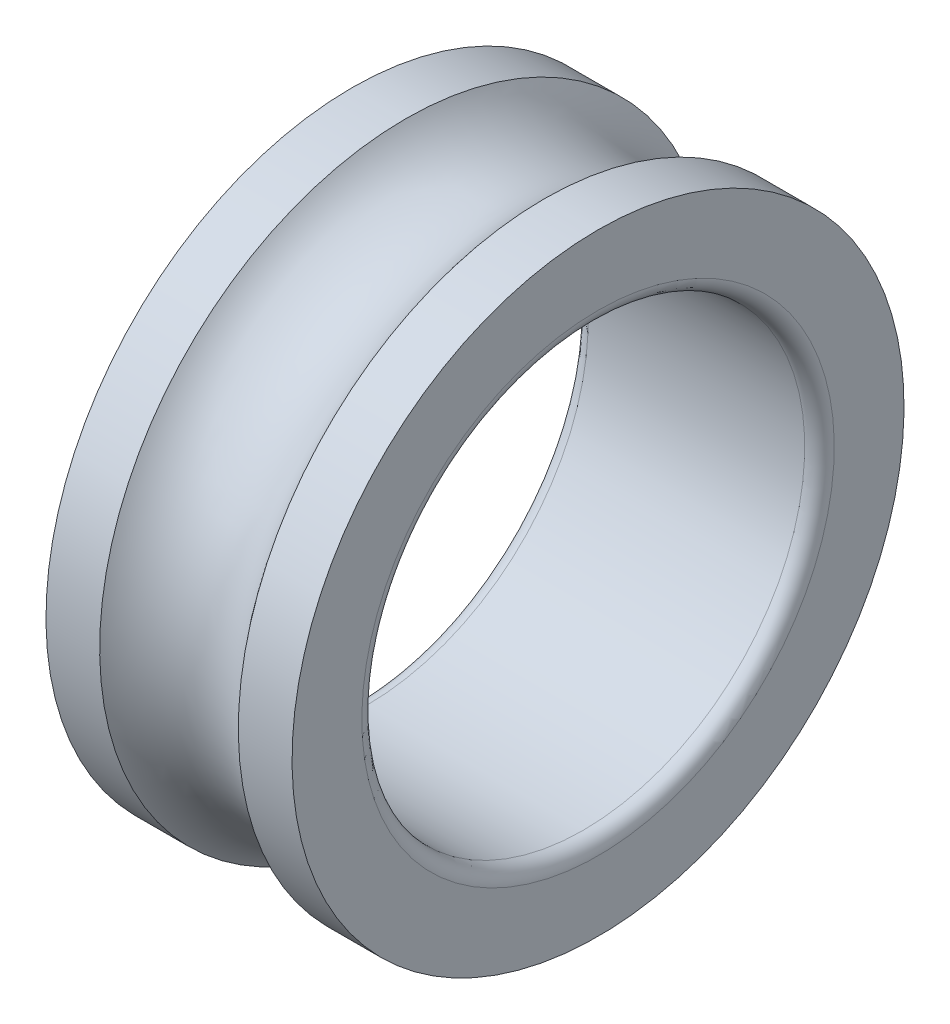
ISO-10303-21;
HEADER;
FILE_DESCRIPTION(('STEP AP214'),'2;1');
FILE_NAME('part.step','',(''),(''),'','','');
FILE_SCHEMA(('AUTOMOTIVE_DESIGN { 1 0 10303 214 1 1 1 1 }'));
ENDSEC;
DATA;
#1=APPLICATION_CONTEXT('core data for automotive mechanical design processes');
#2=APPLICATION_PROTOCOL_DEFINITION('international standard','automotive_design',2000,#1);
#3=PRODUCT_CONTEXT('',#1,'mechanical');
#4=PRODUCT('Part','Part','',(#3));
#5=PRODUCT_RELATED_PRODUCT_CATEGORY('part','',(#4));
#6=PRODUCT_DEFINITION_FORMATION('','',#4);
#7=PRODUCT_DEFINITION_CONTEXT('part definition',#1,'design');
#8=PRODUCT_DEFINITION('design','',#6,#7);
#9=PRODUCT_DEFINITION_SHAPE('','',#8);
#10=(LENGTH_UNIT() NAMED_UNIT(*) SI_UNIT(.MILLI.,.METRE.));
#11=(NAMED_UNIT(*) PLANE_ANGLE_UNIT() SI_UNIT($,.RADIAN.));
#12=(NAMED_UNIT(*) SI_UNIT($,.STERADIAN.) SOLID_ANGLE_UNIT());
#13=UNCERTAINTY_MEASURE_WITH_UNIT(LENGTH_MEASURE(1.E-05),#10,'distance_accuracy_value','');
#14=(GEOMETRIC_REPRESENTATION_CONTEXT(3) GLOBAL_UNCERTAINTY_ASSIGNED_CONTEXT((#13)) GLOBAL_UNIT_ASSIGNED_CONTEXT((#10,
#11,#12)) REPRESENTATION_CONTEXT('',''));
#15=CARTESIAN_POINT('',(0.,0.,0.));
#16=DIRECTION('',(0.,0.,1.));
#17=DIRECTION('',(1.,0.,0.));
#18=AXIS2_PLACEMENT_3D('',#15,#16,#17);
#19=CARTESIAN_POINT('',(22.2715323724197,0.,0.));
#20=DIRECTION('',(-1.,0.,0.));
#21=DIRECTION('',(0.,1.,0.));
#22=AXIS2_PLACEMENT_3D('',#19,#20,#21);
#23=CYLINDRICAL_SURFACE('',#22,31.09);
#24=CARTESIAN_POINT('',(19.5430647448394,0.,0.));
#25=DIRECTION('',(1.,0.,0.));
#26=DIRECTION('',(0.,1.,0.));
#27=AXIS2_PLACEMENT_3D('',#24,#25,#26);
#28=CIRCLE('',#27,31.09);
#29=CARTESIAN_POINT('',(19.5430647448394,31.09,0.));
#30=VERTEX_POINT('',#29);
#31=EDGE_CURVE('E11',#30,#30,#28,.T.);
#32=ORIENTED_EDGE('',*,*,#31,.T.);
#33=EDGE_LOOP('',(#32));
#34=FACE_BOUND('',#33,.T.);
#35=CARTESIAN_POINT('',(25.,0.,0.));
#36=DIRECTION('',(1.,0.,0.));
#37=DIRECTION('',(0.,1.,0.));
#38=AXIS2_PLACEMENT_3D('',#35,#36,#37);
#39=CIRCLE('',#38,31.09);
#40=CARTESIAN_POINT('',(25.,31.09,0.));
#41=VERTEX_POINT('',#40);
#42=EDGE_CURVE('E59',#41,#41,#39,.T.);
#43=ORIENTED_EDGE('',*,*,#42,.F.);
#44=EDGE_LOOP('',(#43));
#45=FACE_BOUND('',#44,.T.);
#46=ADVANCED_FACE('F17',(#34,#45),#23,.T.);
#47=CARTESIAN_POINT('',(12.5,0.,0.));
#48=DIRECTION('',(1.,0.,0.));
#49=DIRECTION('',(0.,0.,-1.));
#50=AXIS2_PLACEMENT_3D('',#47,#48,#49);
#51=TOROIDAL_SURFACE('',#50,36.25,8.731);
#52=CARTESIAN_POINT('',(5.45693525516058,0.,0.));
#53=DIRECTION('',(1.,0.,0.));
#54=DIRECTION('',(0.,1.,0.));
#55=AXIS2_PLACEMENT_3D('',#52,#53,#54);
#56=CIRCLE('',#55,31.09);
#57=CARTESIAN_POINT('',(5.45693525516059,31.09,0.));
#58=VERTEX_POINT('',#57);
#59=EDGE_CURVE('E27',#58,#58,#56,.T.);
#60=ORIENTED_EDGE('',*,*,#59,.T.);
#61=EDGE_LOOP('',(#60));
#62=FACE_BOUND('',#61,.T.);
#63=ORIENTED_EDGE('',*,*,#31,.F.);
#64=EDGE_LOOP('',(#63));
#65=FACE_BOUND('',#64,.T.);
#66=ADVANCED_FACE('F75',(#62,#65),#51,.F.);
#67=CARTESIAN_POINT('',(2.7284676275803,0.,0.));
#68=DIRECTION('',(-1.,0.,0.));
#69=DIRECTION('',(0.,1.,0.));
#70=AXIS2_PLACEMENT_3D('',#67,#68,#69);
#71=CYLINDRICAL_SURFACE('',#70,31.09);
#72=CARTESIAN_POINT('',(0.,0.,0.));
#73=DIRECTION('',(1.,0.,0.));
#74=DIRECTION('',(0.,1.,0.));
#75=AXIS2_PLACEMENT_3D('',#72,#73,#74);
#76=CIRCLE('',#75,31.09);
#77=CARTESIAN_POINT('',(0.,31.09,0.));
#78=VERTEX_POINT('',#77);
#79=EDGE_CURVE('E41',#78,#78,#76,.T.);
#80=ORIENTED_EDGE('',*,*,#79,.T.);
#81=EDGE_LOOP('',(#80));
#82=FACE_BOUND('',#81,.T.);
#83=ORIENTED_EDGE('',*,*,#59,.F.);
#84=EDGE_LOOP('',(#83));
#85=FACE_BOUND('',#84,.T.);
#86=ADVANCED_FACE('F19',(#82,#85),#71,.T.);
#87=CARTESIAN_POINT('',(0.,27.545,0.));
#88=DIRECTION('',(-1.,0.,0.));
#89=DIRECTION('',(0.,-1.,0.));
#90=AXIS2_PLACEMENT_3D('',#87,#88,#89);
#91=PLANE('',#90);
#92=CARTESIAN_POINT('',(0.,0.,0.));
#93=DIRECTION('',(1.,0.,0.));
#94=DIRECTION('',(0.,1.,0.));
#95=AXIS2_PLACEMENT_3D('',#92,#93,#94);
#96=CIRCLE('',#95,24.);
#97=CARTESIAN_POINT('',(0.,24.,0.));
#98=VERTEX_POINT('',#97);
#99=EDGE_CURVE('E47',#98,#98,#96,.T.);
#100=ORIENTED_EDGE('',*,*,#99,.T.);
#101=EDGE_LOOP('',(#100));
#102=FACE_BOUND('',#101,.T.);
#103=ORIENTED_EDGE('',*,*,#79,.F.);
#104=EDGE_LOOP('',(#103));
#105=FACE_BOUND('',#104,.T.);
#106=ADVANCED_FACE('F79',(#102,#105),#91,.T.);
#107=CARTESIAN_POINT('',(1.5,0.,0.));
#108=DIRECTION('',(1.,0.,0.));
#109=DIRECTION('',(0.,0.,-1.));
#110=AXIS2_PLACEMENT_3D('',#107,#108,#109);
#111=TOROIDAL_SURFACE('',#110,24.,1.5);
#112=CARTESIAN_POINT('',(1.5,0.,0.));
#113=DIRECTION('',(1.,0.,0.));
#114=DIRECTION('',(0.,1.,0.));
#115=AXIS2_PLACEMENT_3D('',#112,#113,#114);
#116=CIRCLE('',#115,22.5);
#117=CARTESIAN_POINT('',(1.5,22.5,0.));
#118=VERTEX_POINT('',#117);
#119=EDGE_CURVE('E67',#118,#118,#116,.T.);
#120=ORIENTED_EDGE('',*,*,#119,.T.);
#121=EDGE_LOOP('',(#120));
#122=FACE_BOUND('',#121,.T.);
#123=ORIENTED_EDGE('',*,*,#99,.F.);
#124=EDGE_LOOP('',(#123));
#125=FACE_BOUND('',#124,.T.);
#126=ADVANCED_FACE('F85',(#122,#125),#111,.T.);
#127=CARTESIAN_POINT('',(12.5,0.,0.));
#128=DIRECTION('',(-1.,0.,0.));
#129=DIRECTION('',(0.,1.,0.));
#130=AXIS2_PLACEMENT_3D('',#127,#128,#129);
#131=CYLINDRICAL_SURFACE('',#130,22.5);
#132=CARTESIAN_POINT('',(23.5,0.,0.));
#133=DIRECTION('',(1.,0.,0.));
#134=DIRECTION('',(0.,1.,0.));
#135=AXIS2_PLACEMENT_3D('',#132,#133,#134);
#136=CIRCLE('',#135,22.5);
#137=CARTESIAN_POINT('',(23.5,22.5,0.));
#138=VERTEX_POINT('',#137);
#139=EDGE_CURVE('E63',#138,#138,#136,.T.);
#140=ORIENTED_EDGE('',*,*,#139,.T.);
#141=EDGE_LOOP('',(#140));
#142=FACE_BOUND('',#141,.T.);
#143=ORIENTED_EDGE('',*,*,#119,.F.);
#144=EDGE_LOOP('',(#143));
#145=FACE_BOUND('',#144,.T.);
#146=ADVANCED_FACE('F64',(#142,#145),#131,.F.);
#147=CARTESIAN_POINT('',(23.5,0.,0.));
#148=DIRECTION('',(1.,0.,0.));
#149=DIRECTION('',(0.,0.,-1.));
#150=AXIS2_PLACEMENT_3D('',#147,#148,#149);
#151=TOROIDAL_SURFACE('',#150,24.,1.5);
#152=CARTESIAN_POINT('',(25.,0.,0.));
#153=DIRECTION('',(1.,0.,0.));
#154=DIRECTION('',(0.,1.,0.));
#155=AXIS2_PLACEMENT_3D('',#152,#153,#154);
#156=CIRCLE('',#155,24.);
#157=CARTESIAN_POINT('',(25.,24.,0.));
#158=VERTEX_POINT('',#157);
#159=EDGE_CURVE('E21',#158,#158,#156,.T.);
#160=ORIENTED_EDGE('',*,*,#159,.T.);
#161=EDGE_LOOP('',(#160));
#162=FACE_BOUND('',#161,.T.);
#163=ORIENTED_EDGE('',*,*,#139,.F.);
#164=EDGE_LOOP('',(#163));
#165=FACE_BOUND('',#164,.T.);
#166=ADVANCED_FACE('F98',(#162,#165),#151,.T.);
#167=CARTESIAN_POINT('',(25.,27.545,0.));
#168=DIRECTION('',(1.,0.,0.));
#169=DIRECTION('',(0.,1.,0.));
#170=AXIS2_PLACEMENT_3D('',#167,#168,#169);
#171=PLANE('',#170);
#172=ORIENTED_EDGE('',*,*,#42,.T.);
#173=EDGE_LOOP('',(#172));
#174=FACE_BOUND('',#173,.T.);
#175=ORIENTED_EDGE('',*,*,#159,.F.);
#176=EDGE_LOOP('',(#175));
#177=FACE_BOUND('',#176,.T.);
#178=ADVANCED_FACE('F100',(#174,#177),#171,.T.);
#179=CLOSED_SHELL('',(#46,#66,#86,#106,#126,#146,#166,#178));
#180=MANIFOLD_SOLID_BREP('B1',#179);
#181=ADVANCED_BREP_SHAPE_REPRESENTATION('',(#18,#180),#14);
#182=SHAPE_DEFINITION_REPRESENTATION(#9,#181);
ENDSEC;
END-ISO-10303-21;
